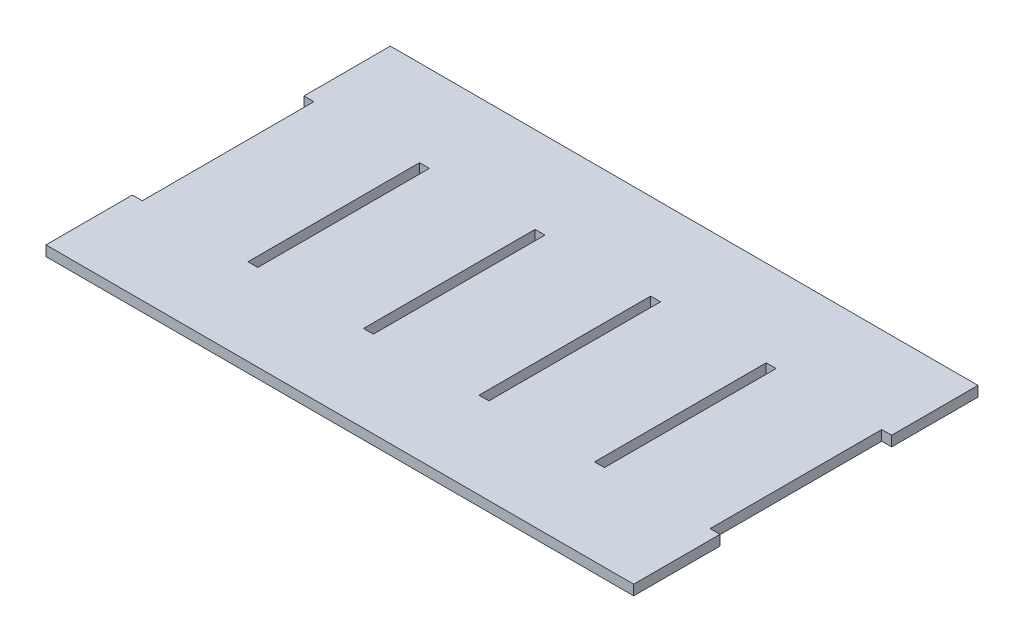
ISO-10303-21;
HEADER;
FILE_DESCRIPTION(('STEP AP214'),'2;1');
FILE_NAME('part.step','',(''),(''),'','','');
FILE_SCHEMA(('AUTOMOTIVE_DESIGN { 1 0 10303 214 1 1 1 1 }'));
ENDSEC;
DATA;
#1=APPLICATION_CONTEXT('core data for automotive mechanical design processes');
#2=APPLICATION_PROTOCOL_DEFINITION('international standard','automotive_design',2000,#1);
#3=PRODUCT_CONTEXT('',#1,'mechanical');
#4=PRODUCT('Part','Part','',(#3));
#5=PRODUCT_RELATED_PRODUCT_CATEGORY('part','',(#4));
#6=PRODUCT_DEFINITION_FORMATION('','',#4);
#7=PRODUCT_DEFINITION_CONTEXT('part definition',#1,'design');
#8=PRODUCT_DEFINITION('design','',#6,#7);
#9=PRODUCT_DEFINITION_SHAPE('','',#8);
#10=(LENGTH_UNIT() NAMED_UNIT(*) SI_UNIT(.MILLI.,.METRE.));
#11=(NAMED_UNIT(*) PLANE_ANGLE_UNIT() SI_UNIT($,.RADIAN.));
#12=(NAMED_UNIT(*) SI_UNIT($,.STERADIAN.) SOLID_ANGLE_UNIT());
#13=UNCERTAINTY_MEASURE_WITH_UNIT(LENGTH_MEASURE(1.E-05),#10,'distance_accuracy_value','');
#14=(GEOMETRIC_REPRESENTATION_CONTEXT(3) GLOBAL_UNCERTAINTY_ASSIGNED_CONTEXT((#13)) GLOBAL_UNIT_ASSIGNED_CONTEXT((#10,
#11,#12)) REPRESENTATION_CONTEXT('',''));
#15=CARTESIAN_POINT('',(0.,0.,0.));
#16=DIRECTION('',(0.,0.,1.));
#17=DIRECTION('',(1.,0.,0.));
#18=AXIS2_PLACEMENT_3D('',#15,#16,#17);
#19=CARTESIAN_POINT('',(173.4,3.,0.));
#20=DIRECTION('',(-1.,0.,0.));
#21=DIRECTION('',(0.,0.,1.));
#22=AXIS2_PLACEMENT_3D('',#19,#20,#21);
#23=PLANE('',#22);
#24=DIRECTION('',(0.,0.,-1.));
#25=VECTOR('',#24,1.);
#26=CARTESIAN_POINT('',(173.4,0.,0.));
#27=LINE('',#26,#25);
#28=CARTESIAN_POINT('',(173.4,0.,0.));
#29=VERTEX_POINT('',#28);
#30=CARTESIAN_POINT('',(173.4,0.,-25.48));
#31=VERTEX_POINT('',#30);
#32=EDGE_CURVE('E243',#29,#31,#27,.T.);
#33=ORIENTED_EDGE('',*,*,#32,.T.);
#34=DIRECTION('',(0.,1.,0.));
#35=VECTOR('',#34,1.);
#36=CARTESIAN_POINT('',(173.4,0.,-25.48));
#37=LINE('',#36,#35);
#38=CARTESIAN_POINT('',(173.4,3.,-25.48));
#39=VERTEX_POINT('',#38);
#40=EDGE_CURVE('E281',#31,#39,#37,.T.);
#41=ORIENTED_EDGE('',*,*,#40,.T.);
#42=DIRECTION('',(0.,0.,-1.));
#43=VECTOR('',#42,1.);
#44=CARTESIAN_POINT('',(173.4,3.,0.));
#45=LINE('',#44,#43);
#46=CARTESIAN_POINT('',(173.4,3.,0.));
#47=VERTEX_POINT('',#46);
#48=EDGE_CURVE('E265',#47,#39,#45,.T.);
#49=ORIENTED_EDGE('',*,*,#48,.F.);
#50=DIRECTION('',(0.,-1.,0.));
#51=VECTOR('',#50,1.);
#52=CARTESIAN_POINT('',(173.4,3.,0.));
#53=LINE('',#52,#51);
#54=EDGE_CURVE('E41',#47,#29,#53,.T.);
#55=ORIENTED_EDGE('',*,*,#54,.T.);
#56=EDGE_LOOP('',(#33,#41,#49,#55));
#57=FACE_BOUND('',#56,.T.);
#58=ADVANCED_FACE('F33',(#57),#23,.F.);
#59=CARTESIAN_POINT('',(0.,3.,0.));
#60=DIRECTION('',(1.,0.,0.));
#61=DIRECTION('',(0.,0.,-1.));
#62=AXIS2_PLACEMENT_3D('',#59,#60,#61);
#63=PLANE('',#62);
#64=DIRECTION('',(0.,0.,1.));
#65=VECTOR('',#64,1.);
#66=CARTESIAN_POINT('',(0.,3.,0.));
#67=LINE('',#66,#65);
#68=CARTESIAN_POINT('',(0.,3.,-25.48));
#69=VERTEX_POINT('',#68);
#70=CARTESIAN_POINT('',(0.,3.,0.));
#71=VERTEX_POINT('',#70);
#72=EDGE_CURVE('E252',#69,#71,#67,.T.);
#73=ORIENTED_EDGE('',*,*,#72,.F.);
#74=DIRECTION('',(0.,1.,0.));
#75=VECTOR('',#74,1.);
#76=CARTESIAN_POINT('',(0.,0.,-25.48));
#77=LINE('',#76,#75);
#78=CARTESIAN_POINT('',(0.,0.,-25.48));
#79=VERTEX_POINT('',#78);
#80=EDGE_CURVE('E433',#79,#69,#77,.T.);
#81=ORIENTED_EDGE('',*,*,#80,.F.);
#82=DIRECTION('',(0.,0.,1.));
#83=VECTOR('',#82,1.);
#84=CARTESIAN_POINT('',(0.,0.,0.));
#85=LINE('',#84,#83);
#86=CARTESIAN_POINT('',(0.,0.,0.));
#87=VERTEX_POINT('',#86);
#88=EDGE_CURVE('E432',#79,#87,#85,.T.);
#89=ORIENTED_EDGE('',*,*,#88,.T.);
#90=DIRECTION('',(0.,-1.,0.));
#91=VECTOR('',#90,1.);
#92=CARTESIAN_POINT('',(0.,3.,0.));
#93=LINE('',#92,#91);
#94=EDGE_CURVE('E11',#71,#87,#93,.T.);
#95=ORIENTED_EDGE('',*,*,#94,.F.);
#96=EDGE_LOOP('',(#73,#81,#89,#95));
#97=FACE_BOUND('',#96,.T.);
#98=ADVANCED_FACE('F451',(#97),#63,.F.);
#99=CARTESIAN_POINT('',(0.,0.,-101.6));
#100=VERTEX_POINT('',#99);
#101=CARTESIAN_POINT('',(0.,0.,-76.12));
#102=VERTEX_POINT('',#101);
#103=EDGE_CURVE('E247',#100,#102,#85,.T.);
#104=ORIENTED_EDGE('',*,*,#103,.T.);
#105=DIRECTION('',(0.,1.,0.));
#106=VECTOR('',#105,1.);
#107=CARTESIAN_POINT('',(0.,0.,-76.12));
#108=LINE('',#107,#106);
#109=CARTESIAN_POINT('',(0.,3.,-76.12));
#110=VERTEX_POINT('',#109);
#111=EDGE_CURVE('E435',#102,#110,#108,.T.);
#112=ORIENTED_EDGE('',*,*,#111,.T.);
#113=CARTESIAN_POINT('',(0.,3.,-101.6));
#114=VERTEX_POINT('',#113);
#115=EDGE_CURVE('E439',#114,#110,#67,.T.);
#116=ORIENTED_EDGE('',*,*,#115,.F.);
#117=DIRECTION('',(0.,-1.,0.));
#118=VECTOR('',#117,1.);
#119=CARTESIAN_POINT('',(0.,3.,-101.6));
#120=LINE('',#119,#118);
#121=EDGE_CURVE('E253',#114,#100,#120,.T.);
#122=ORIENTED_EDGE('',*,*,#121,.T.);
#123=EDGE_LOOP('',(#104,#112,#116,#122));
#124=FACE_BOUND('',#123,.T.);
#125=ADVANCED_FACE('F35',(#124),#63,.F.);
#126=CARTESIAN_POINT('',(0.,3.,0.));
#127=DIRECTION('',(0.,0.,-1.));
#128=DIRECTION('',(-1.,0.,0.));
#129=AXIS2_PLACEMENT_3D('',#126,#127,#128);
#130=PLANE('',#129);
#131=DIRECTION('',(1.,0.,0.));
#132=VECTOR('',#131,1.);
#133=CARTESIAN_POINT('',(0.,0.,0.));
#134=LINE('',#133,#132);
#135=EDGE_CURVE('E244',#87,#29,#134,.T.);
#136=ORIENTED_EDGE('',*,*,#135,.T.);
#137=ORIENTED_EDGE('',*,*,#54,.F.);
#138=DIRECTION('',(1.,0.,0.));
#139=VECTOR('',#138,1.);
#140=CARTESIAN_POINT('',(0.,3.,0.));
#141=LINE('',#140,#139);
#142=EDGE_CURVE('E442',#71,#47,#141,.T.);
#143=ORIENTED_EDGE('',*,*,#142,.F.);
#144=ORIENTED_EDGE('',*,*,#94,.T.);
#145=EDGE_LOOP('',(#136,#137,#143,#144));
#146=FACE_BOUND('',#145,.T.);
#147=ADVANCED_FACE('F478',(#146),#130,.F.);
#148=CARTESIAN_POINT('',(173.4,3.,-76.12));
#149=VERTEX_POINT('',#148);
#150=CARTESIAN_POINT('',(173.4,3.,-101.6));
#151=VERTEX_POINT('',#150);
#152=EDGE_CURVE('E234',#149,#151,#45,.T.);
#153=ORIENTED_EDGE('',*,*,#152,.F.);
#154=DIRECTION('',(0.,1.,0.));
#155=VECTOR('',#154,1.);
#156=CARTESIAN_POINT('',(173.4,0.,-76.12));
#157=LINE('',#156,#155);
#158=CARTESIAN_POINT('',(173.4,0.,-76.12));
#159=VERTEX_POINT('',#158);
#160=EDGE_CURVE('E221',#159,#149,#157,.T.);
#161=ORIENTED_EDGE('',*,*,#160,.F.);
#162=CARTESIAN_POINT('',(173.4,0.,-101.6));
#163=VERTEX_POINT('',#162);
#164=EDGE_CURVE('E232',#159,#163,#27,.T.);
#165=ORIENTED_EDGE('',*,*,#164,.T.);
#166=DIRECTION('',(0.,-1.,0.));
#167=VECTOR('',#166,1.);
#168=CARTESIAN_POINT('',(173.4,3.,-101.6));
#169=LINE('',#168,#167);
#170=EDGE_CURVE('E256',#151,#163,#169,.T.);
#171=ORIENTED_EDGE('',*,*,#170,.F.);
#172=EDGE_LOOP('',(#153,#161,#165,#171));
#173=FACE_BOUND('',#172,.T.);
#174=ADVANCED_FACE('F230',(#173),#23,.F.);
#175=CARTESIAN_POINT('',(0.,3.,-101.6));
#176=DIRECTION('',(0.,0.,1.));
#177=DIRECTION('',(1.,0.,0.));
#178=AXIS2_PLACEMENT_3D('',#175,#176,#177);
#179=PLANE('',#178);
#180=DIRECTION('',(-1.,0.,0.));
#181=VECTOR('',#180,1.);
#182=CARTESIAN_POINT('',(0.,0.,-101.6));
#183=LINE('',#182,#181);
#184=EDGE_CURVE('E242',#163,#100,#183,.T.);
#185=ORIENTED_EDGE('',*,*,#184,.T.);
#186=ORIENTED_EDGE('',*,*,#121,.F.);
#187=DIRECTION('',(-1.,0.,0.));
#188=VECTOR('',#187,1.);
#189=CARTESIAN_POINT('',(0.,3.,-101.6));
#190=LINE('',#189,#188);
#191=EDGE_CURVE('E257',#151,#114,#190,.T.);
#192=ORIENTED_EDGE('',*,*,#191,.F.);
#193=ORIENTED_EDGE('',*,*,#170,.T.);
#194=EDGE_LOOP('',(#185,#186,#192,#193));
#195=FACE_BOUND('',#194,.T.);
#196=ADVANCED_FACE('F469',(#195),#179,.F.);
#197=CARTESIAN_POINT('',(0.,3.,0.));
#198=DIRECTION('',(0.,-1.,0.));
#199=DIRECTION('',(0.,0.,-1.));
#200=AXIS2_PLACEMENT_3D('',#197,#198,#199);
#201=PLANE('',#200);
#202=DIRECTION('',(-1.,0.,0.));
#203=VECTOR('',#202,1.);
#204=CARTESIAN_POINT('',(37.016,3.,-76.12));
#205=LINE('',#204,#203);
#206=CARTESIAN_POINT('',(37.016,3.,-76.12));
#207=VERTEX_POINT('',#206);
#208=CARTESIAN_POINT('',(34.096,3.,-76.12));
#209=VERTEX_POINT('',#208);
#210=EDGE_CURVE('E302',#207,#209,#205,.T.);
#211=ORIENTED_EDGE('',*,*,#210,.F.);
#212=DIRECTION('',(0.,0.,-1.));
#213=VECTOR('',#212,1.);
#214=CARTESIAN_POINT('',(37.016,3.,-25.48));
#215=LINE('',#214,#213);
#216=CARTESIAN_POINT('',(37.016,3.,-25.48));
#217=VERTEX_POINT('',#216);
#218=EDGE_CURVE('E56',#217,#207,#215,.T.);
#219=ORIENTED_EDGE('',*,*,#218,.F.);
#220=DIRECTION('',(1.,0.,0.));
#221=VECTOR('',#220,1.);
#222=CARTESIAN_POINT('',(37.016,3.,-25.48));
#223=LINE('',#222,#221);
#224=CARTESIAN_POINT('',(34.096,3.,-25.48));
#225=VERTEX_POINT('',#224);
#226=EDGE_CURVE('E291',#225,#217,#223,.T.);
#227=ORIENTED_EDGE('',*,*,#226,.F.);
#228=DIRECTION('',(0.,0.,1.));
#229=VECTOR('',#228,1.);
#230=CARTESIAN_POINT('',(34.096,3.,-25.48));
#231=LINE('',#230,#229);
#232=EDGE_CURVE('E306',#209,#225,#231,.T.);
#233=ORIENTED_EDGE('',*,*,#232,.F.);
#234=EDGE_LOOP('',(#211,#219,#227,#233));
#235=FACE_BOUND('',#234,.T.);
#236=DIRECTION('',(-1.,0.,0.));
#237=VECTOR('',#236,1.);
#238=CARTESIAN_POINT('',(71.112,3.,-76.12));
#239=LINE('',#238,#237);
#240=CARTESIAN_POINT('',(71.112,3.,-76.12));
#241=VERTEX_POINT('',#240);
#242=CARTESIAN_POINT('',(68.192,3.,-76.12));
#243=VERTEX_POINT('',#242);
#244=EDGE_CURVE('E335',#241,#243,#239,.T.);
#245=ORIENTED_EDGE('',*,*,#244,.F.);
#246=DIRECTION('',(0.,0.,-1.));
#247=VECTOR('',#246,1.);
#248=CARTESIAN_POINT('',(71.112,3.,-25.48));
#249=LINE('',#248,#247);
#250=CARTESIAN_POINT('',(71.112,3.,-25.48));
#251=VERTEX_POINT('',#250);
#252=EDGE_CURVE('E333',#251,#241,#249,.T.);
#253=ORIENTED_EDGE('',*,*,#252,.F.);
#254=DIRECTION('',(1.,0.,0.));
#255=VECTOR('',#254,1.);
#256=CARTESIAN_POINT('',(71.112,3.,-25.48));
#257=LINE('',#256,#255);
#258=CARTESIAN_POINT('',(68.192,3.,-25.48));
#259=VERTEX_POINT('',#258);
#260=EDGE_CURVE('E323',#259,#251,#257,.T.);
#261=ORIENTED_EDGE('',*,*,#260,.F.);
#262=DIRECTION('',(0.,0.,1.));
#263=VECTOR('',#262,1.);
#264=CARTESIAN_POINT('',(68.192,3.,-25.48));
#265=LINE('',#264,#263);
#266=EDGE_CURVE('E339',#243,#259,#265,.T.);
#267=ORIENTED_EDGE('',*,*,#266,.F.);
#268=EDGE_LOOP('',(#245,#253,#261,#267));
#269=FACE_BOUND('',#268,.T.);
#270=DIRECTION('',(-1.,0.,0.));
#271=VECTOR('',#270,1.);
#272=CARTESIAN_POINT('',(105.208,3.,-76.12));
#273=LINE('',#272,#271);
#274=CARTESIAN_POINT('',(105.208,3.,-76.12));
#275=VERTEX_POINT('',#274);
#276=CARTESIAN_POINT('',(102.288,3.,-76.12));
#277=VERTEX_POINT('',#276);
#278=EDGE_CURVE('E367',#275,#277,#273,.T.);
#279=ORIENTED_EDGE('',*,*,#278,.F.);
#280=DIRECTION('',(0.,0.,-1.));
#281=VECTOR('',#280,1.);
#282=CARTESIAN_POINT('',(105.208,3.,-25.48));
#283=LINE('',#282,#281);
#284=CARTESIAN_POINT('',(105.208,3.,-25.48));
#285=VERTEX_POINT('',#284);
#286=EDGE_CURVE('E365',#285,#275,#283,.T.);
#287=ORIENTED_EDGE('',*,*,#286,.F.);
#288=DIRECTION('',(1.,0.,0.));
#289=VECTOR('',#288,1.);
#290=CARTESIAN_POINT('',(105.208,3.,-25.48));
#291=LINE('',#290,#289);
#292=CARTESIAN_POINT('',(102.288,3.,-25.48));
#293=VERTEX_POINT('',#292);
#294=EDGE_CURVE('E355',#293,#285,#291,.T.);
#295=ORIENTED_EDGE('',*,*,#294,.F.);
#296=DIRECTION('',(0.,0.,1.));
#297=VECTOR('',#296,1.);
#298=CARTESIAN_POINT('',(102.288,3.,-25.48));
#299=LINE('',#298,#297);
#300=EDGE_CURVE('E371',#277,#293,#299,.T.);
#301=ORIENTED_EDGE('',*,*,#300,.F.);
#302=EDGE_LOOP('',(#279,#287,#295,#301));
#303=FACE_BOUND('',#302,.T.);
#304=DIRECTION('',(-1.,0.,0.));
#305=VECTOR('',#304,1.);
#306=CARTESIAN_POINT('',(139.304,3.,-76.12));
#307=LINE('',#306,#305);
#308=CARTESIAN_POINT('',(139.304,3.,-76.12));
#309=VERTEX_POINT('',#308);
#310=CARTESIAN_POINT('',(136.384,3.,-76.12));
#311=VERTEX_POINT('',#310);
#312=EDGE_CURVE('E398',#309,#311,#307,.T.);
#313=ORIENTED_EDGE('',*,*,#312,.F.);
#314=DIRECTION('',(0.,0.,-1.));
#315=VECTOR('',#314,1.);
#316=CARTESIAN_POINT('',(139.304,3.,-25.48));
#317=LINE('',#316,#315);
#318=CARTESIAN_POINT('',(139.304,3.,-25.48));
#319=VERTEX_POINT('',#318);
#320=EDGE_CURVE('E283',#319,#309,#317,.T.);
#321=ORIENTED_EDGE('',*,*,#320,.F.);
#322=DIRECTION('',(1.,0.,0.));
#323=VECTOR('',#322,1.);
#324=CARTESIAN_POINT('',(139.304,3.,-25.48));
#325=LINE('',#324,#323);
#326=CARTESIAN_POINT('',(136.384,3.,-25.48));
#327=VERTEX_POINT('',#326);
#328=EDGE_CURVE('E387',#327,#319,#325,.T.);
#329=ORIENTED_EDGE('',*,*,#328,.F.);
#330=DIRECTION('',(0.,0.,1.));
#331=VECTOR('',#330,1.);
#332=CARTESIAN_POINT('',(136.384,3.,-25.48));
#333=LINE('',#332,#331);
#334=EDGE_CURVE('E401',#311,#327,#333,.T.);
#335=ORIENTED_EDGE('',*,*,#334,.F.);
#336=EDGE_LOOP('',(#313,#321,#329,#335));
#337=FACE_BOUND('',#336,.T.);
#338=ORIENTED_EDGE('',*,*,#48,.T.);
#339=DIRECTION('',(1.,0.,0.));
#340=VECTOR('',#339,1.);
#341=CARTESIAN_POINT('',(173.4,3.,-25.48));
#342=LINE('',#341,#340);
#343=CARTESIAN_POINT('',(170.48,3.,-25.48));
#344=VERTEX_POINT('',#343);
#345=EDGE_CURVE('E226',#344,#39,#342,.T.);
#346=ORIENTED_EDGE('',*,*,#345,.F.);
#347=DIRECTION('',(0.,0.,1.));
#348=VECTOR('',#347,1.);
#349=CARTESIAN_POINT('',(170.48,3.,-25.48));
#350=LINE('',#349,#348);
#351=CARTESIAN_POINT('',(170.48,3.,-76.12));
#352=VERTEX_POINT('',#351);
#353=EDGE_CURVE('E277',#352,#344,#350,.T.);
#354=ORIENTED_EDGE('',*,*,#353,.F.);
#355=DIRECTION('',(-1.,0.,0.));
#356=VECTOR('',#355,1.);
#357=CARTESIAN_POINT('',(173.4,3.,-76.12));
#358=LINE('',#357,#356);
#359=EDGE_CURVE('E275',#149,#352,#358,.T.);
#360=ORIENTED_EDGE('',*,*,#359,.F.);
#361=ORIENTED_EDGE('',*,*,#152,.T.);
#362=ORIENTED_EDGE('',*,*,#191,.T.);
#363=ORIENTED_EDGE('',*,*,#115,.T.);
#364=DIRECTION('',(-1.,0.,0.));
#365=VECTOR('',#364,1.);
#366=CARTESIAN_POINT('',(2.92,3.,-76.12));
#367=LINE('',#366,#365);
#368=CARTESIAN_POINT('',(2.92,3.,-76.12));
#369=VERTEX_POINT('',#368);
#370=EDGE_CURVE('E426',#369,#110,#367,.T.);
#371=ORIENTED_EDGE('',*,*,#370,.F.);
#372=DIRECTION('',(0.,0.,-1.));
#373=VECTOR('',#372,1.);
#374=CARTESIAN_POINT('',(2.92,3.,-25.48));
#375=LINE('',#374,#373);
#376=CARTESIAN_POINT('',(2.92,3.,-25.48));
#377=VERTEX_POINT('',#376);
#378=EDGE_CURVE('E313',#377,#369,#375,.T.);
#379=ORIENTED_EDGE('',*,*,#378,.F.);
#380=DIRECTION('',(1.,0.,0.));
#381=VECTOR('',#380,1.);
#382=CARTESIAN_POINT('',(2.92,3.,-25.48));
#383=LINE('',#382,#381);
#384=EDGE_CURVE('E417',#69,#377,#383,.T.);
#385=ORIENTED_EDGE('',*,*,#384,.F.);
#386=ORIENTED_EDGE('',*,*,#72,.T.);
#387=ORIENTED_EDGE('',*,*,#142,.T.);
#388=EDGE_LOOP('',(#338,#346,#354,#360,#361,#362,#363,#371,#379,#385,#386,#387));
#389=FACE_BOUND('',#388,.T.);
#390=ADVANCED_FACE('F465',(#235,#269,#303,#337,#389),#201,.F.);
#391=CARTESIAN_POINT('',(0.,0.,0.));
#392=DIRECTION('',(0.,-1.,0.));
#393=DIRECTION('',(0.,0.,-1.));
#394=AXIS2_PLACEMENT_3D('',#391,#392,#393);
#395=PLANE('',#394);
#396=DIRECTION('',(1.,0.,0.));
#397=VECTOR('',#396,1.);
#398=CARTESIAN_POINT('',(173.4,0.,-25.48));
#399=LINE('',#398,#397);
#400=CARTESIAN_POINT('',(170.48,0.,-25.48));
#401=VERTEX_POINT('',#400);
#402=EDGE_CURVE('E235',#401,#31,#399,.T.);
#403=ORIENTED_EDGE('',*,*,#402,.T.);
#404=ORIENTED_EDGE('',*,*,#32,.F.);
#405=ORIENTED_EDGE('',*,*,#135,.F.);
#406=ORIENTED_EDGE('',*,*,#88,.F.);
#407=DIRECTION('',(1.,0.,0.));
#408=VECTOR('',#407,1.);
#409=CARTESIAN_POINT('',(2.92,0.,-25.48));
#410=LINE('',#409,#408);
#411=CARTESIAN_POINT('',(2.92,0.,-25.48));
#412=VERTEX_POINT('',#411);
#413=EDGE_CURVE('E420',#79,#412,#410,.T.);
#414=ORIENTED_EDGE('',*,*,#413,.T.);
#415=DIRECTION('',(0.,0.,-1.));
#416=VECTOR('',#415,1.);
#417=CARTESIAN_POINT('',(2.92,0.,-25.48));
#418=LINE('',#417,#416);
#419=CARTESIAN_POINT('',(2.92,0.,-76.12));
#420=VERTEX_POINT('',#419);
#421=EDGE_CURVE('E413',#412,#420,#418,.T.);
#422=ORIENTED_EDGE('',*,*,#421,.T.);
#423=DIRECTION('',(-1.,0.,0.));
#424=VECTOR('',#423,1.);
#425=CARTESIAN_POINT('',(2.92,0.,-76.12));
#426=LINE('',#425,#424);
#427=EDGE_CURVE('E416',#420,#102,#426,.T.);
#428=ORIENTED_EDGE('',*,*,#427,.T.);
#429=ORIENTED_EDGE('',*,*,#103,.F.);
#430=ORIENTED_EDGE('',*,*,#184,.F.);
#431=ORIENTED_EDGE('',*,*,#164,.F.);
#432=DIRECTION('',(-1.,0.,0.));
#433=VECTOR('',#432,1.);
#434=CARTESIAN_POINT('',(173.4,0.,-76.12));
#435=LINE('',#434,#433);
#436=CARTESIAN_POINT('',(170.48,0.,-76.12));
#437=VERTEX_POINT('',#436);
#438=EDGE_CURVE('E217',#159,#437,#435,.T.);
#439=ORIENTED_EDGE('',*,*,#438,.T.);
#440=DIRECTION('',(0.,0.,1.));
#441=VECTOR('',#440,1.);
#442=CARTESIAN_POINT('',(170.48,0.,-25.48));
#443=LINE('',#442,#441);
#444=EDGE_CURVE('E48',#437,#401,#443,.T.);
#445=ORIENTED_EDGE('',*,*,#444,.T.);
#446=EDGE_LOOP('',(#403,#404,#405,#406,#414,#422,#428,#429,#430,#431,#439,#445));
#447=FACE_BOUND('',#446,.T.);
#448=DIRECTION('',(0.,0.,-1.));
#449=VECTOR('',#448,1.);
#450=CARTESIAN_POINT('',(37.016,0.,-25.48));
#451=LINE('',#450,#449);
#452=CARTESIAN_POINT('',(37.016,0.,-25.48));
#453=VERTEX_POINT('',#452);
#454=CARTESIAN_POINT('',(37.016,0.,-76.12));
#455=VERTEX_POINT('',#454);
#456=EDGE_CURVE('E287',#453,#455,#451,.T.);
#457=ORIENTED_EDGE('',*,*,#456,.T.);
#458=DIRECTION('',(-1.,0.,0.));
#459=VECTOR('',#458,1.);
#460=CARTESIAN_POINT('',(37.016,0.,-76.12));
#461=LINE('',#460,#459);
#462=CARTESIAN_POINT('',(34.096,0.,-76.12));
#463=VERTEX_POINT('',#462);
#464=EDGE_CURVE('E290',#455,#463,#461,.T.);
#465=ORIENTED_EDGE('',*,*,#464,.T.);
#466=DIRECTION('',(0.,0.,1.));
#467=VECTOR('',#466,1.);
#468=CARTESIAN_POINT('',(34.096,0.,-25.48));
#469=LINE('',#468,#467);
#470=CARTESIAN_POINT('',(34.096,0.,-25.48));
#471=VERTEX_POINT('',#470);
#472=EDGE_CURVE('E294',#463,#471,#469,.T.);
#473=ORIENTED_EDGE('',*,*,#472,.T.);
#474=DIRECTION('',(1.,0.,0.));
#475=VECTOR('',#474,1.);
#476=CARTESIAN_POINT('',(37.016,0.,-25.48));
#477=LINE('',#476,#475);
#478=EDGE_CURVE('E297',#471,#453,#477,.T.);
#479=ORIENTED_EDGE('',*,*,#478,.T.);
#480=EDGE_LOOP('',(#457,#465,#473,#479));
#481=FACE_BOUND('',#480,.T.);
#482=DIRECTION('',(0.,0.,-1.));
#483=VECTOR('',#482,1.);
#484=CARTESIAN_POINT('',(71.112,0.,-25.48));
#485=LINE('',#484,#483);
#486=CARTESIAN_POINT('',(71.112,0.,-25.48));
#487=VERTEX_POINT('',#486);
#488=CARTESIAN_POINT('',(71.112,0.,-76.12));
#489=VERTEX_POINT('',#488);
#490=EDGE_CURVE('E319',#487,#489,#485,.T.);
#491=ORIENTED_EDGE('',*,*,#490,.T.);
#492=DIRECTION('',(-1.,0.,0.));
#493=VECTOR('',#492,1.);
#494=CARTESIAN_POINT('',(71.112,0.,-76.12));
#495=LINE('',#494,#493);
#496=CARTESIAN_POINT('',(68.192,0.,-76.12));
#497=VERTEX_POINT('',#496);
#498=EDGE_CURVE('E322',#489,#497,#495,.T.);
#499=ORIENTED_EDGE('',*,*,#498,.T.);
#500=DIRECTION('',(0.,0.,1.));
#501=VECTOR('',#500,1.);
#502=CARTESIAN_POINT('',(68.192,0.,-25.48));
#503=LINE('',#502,#501);
#504=CARTESIAN_POINT('',(68.192,0.,-25.48));
#505=VERTEX_POINT('',#504);
#506=EDGE_CURVE('E326',#497,#505,#503,.T.);
#507=ORIENTED_EDGE('',*,*,#506,.T.);
#508=DIRECTION('',(1.,0.,0.));
#509=VECTOR('',#508,1.);
#510=CARTESIAN_POINT('',(71.112,0.,-25.48));
#511=LINE('',#510,#509);
#512=EDGE_CURVE('E329',#505,#487,#511,.T.);
#513=ORIENTED_EDGE('',*,*,#512,.T.);
#514=EDGE_LOOP('',(#491,#499,#507,#513));
#515=FACE_BOUND('',#514,.T.);
#516=DIRECTION('',(0.,0.,-1.));
#517=VECTOR('',#516,1.);
#518=CARTESIAN_POINT('',(105.208,0.,-25.48));
#519=LINE('',#518,#517);
#520=CARTESIAN_POINT('',(105.208,0.,-25.48));
#521=VERTEX_POINT('',#520);
#522=CARTESIAN_POINT('',(105.208,0.,-76.12));
#523=VERTEX_POINT('',#522);
#524=EDGE_CURVE('E351',#521,#523,#519,.T.);
#525=ORIENTED_EDGE('',*,*,#524,.T.);
#526=DIRECTION('',(-1.,0.,0.));
#527=VECTOR('',#526,1.);
#528=CARTESIAN_POINT('',(105.208,0.,-76.12));
#529=LINE('',#528,#527);
#530=CARTESIAN_POINT('',(102.288,0.,-76.12));
#531=VERTEX_POINT('',#530);
#532=EDGE_CURVE('E354',#523,#531,#529,.T.);
#533=ORIENTED_EDGE('',*,*,#532,.T.);
#534=DIRECTION('',(0.,0.,1.));
#535=VECTOR('',#534,1.);
#536=CARTESIAN_POINT('',(102.288,0.,-25.48));
#537=LINE('',#536,#535);
#538=CARTESIAN_POINT('',(102.288,0.,-25.48));
#539=VERTEX_POINT('',#538);
#540=EDGE_CURVE('E358',#531,#539,#537,.T.);
#541=ORIENTED_EDGE('',*,*,#540,.T.);
#542=DIRECTION('',(1.,0.,0.));
#543=VECTOR('',#542,1.);
#544=CARTESIAN_POINT('',(105.208,0.,-25.48));
#545=LINE('',#544,#543);
#546=EDGE_CURVE('E361',#539,#521,#545,.T.);
#547=ORIENTED_EDGE('',*,*,#546,.T.);
#548=EDGE_LOOP('',(#525,#533,#541,#547));
#549=FACE_BOUND('',#548,.T.);
#550=DIRECTION('',(0.,0.,-1.));
#551=VECTOR('',#550,1.);
#552=CARTESIAN_POINT('',(139.304,0.,-25.48));
#553=LINE('',#552,#551);
#554=CARTESIAN_POINT('',(139.304,0.,-25.48));
#555=VERTEX_POINT('',#554);
#556=CARTESIAN_POINT('',(139.304,0.,-76.12));
#557=VERTEX_POINT('',#556);
#558=EDGE_CURVE('E383',#555,#557,#553,.T.);
#559=ORIENTED_EDGE('',*,*,#558,.T.);
#560=DIRECTION('',(-1.,0.,0.));
#561=VECTOR('',#560,1.);
#562=CARTESIAN_POINT('',(139.304,0.,-76.12));
#563=LINE('',#562,#561);
#564=CARTESIAN_POINT('',(136.384,0.,-76.12));
#565=VERTEX_POINT('',#564);
#566=EDGE_CURVE('E386',#557,#565,#563,.T.);
#567=ORIENTED_EDGE('',*,*,#566,.T.);
#568=DIRECTION('',(0.,0.,1.));
#569=VECTOR('',#568,1.);
#570=CARTESIAN_POINT('',(136.384,0.,-25.48));
#571=LINE('',#570,#569);
#572=CARTESIAN_POINT('',(136.384,0.,-25.48));
#573=VERTEX_POINT('',#572);
#574=EDGE_CURVE('E390',#565,#573,#571,.T.);
#575=ORIENTED_EDGE('',*,*,#574,.T.);
#576=DIRECTION('',(1.,0.,0.));
#577=VECTOR('',#576,1.);
#578=CARTESIAN_POINT('',(139.304,0.,-25.48));
#579=LINE('',#578,#577);
#580=EDGE_CURVE('E393',#573,#555,#579,.T.);
#581=ORIENTED_EDGE('',*,*,#580,.T.);
#582=EDGE_LOOP('',(#559,#567,#575,#581));
#583=FACE_BOUND('',#582,.T.);
#584=ADVANCED_FACE('F239',(#447,#481,#515,#549,#583),#395,.T.);
#585=CARTESIAN_POINT('',(2.92,0.,-25.48));
#586=DIRECTION('',(1.,0.,0.));
#587=DIRECTION('',(0.,0.,-1.));
#588=AXIS2_PLACEMENT_3D('',#585,#586,#587);
#589=PLANE('',#588);
#590=ORIENTED_EDGE('',*,*,#378,.T.);
#591=DIRECTION('',(0.,1.,0.));
#592=VECTOR('',#591,1.);
#593=CARTESIAN_POINT('',(2.92,0.,-76.12));
#594=LINE('',#593,#592);
#595=EDGE_CURVE('E423',#420,#369,#594,.T.);
#596=ORIENTED_EDGE('',*,*,#595,.F.);
#597=ORIENTED_EDGE('',*,*,#421,.F.);
#598=DIRECTION('',(0.,1.,0.));
#599=VECTOR('',#598,1.);
#600=CARTESIAN_POINT('',(2.92,0.,-25.48));
#601=LINE('',#600,#599);
#602=EDGE_CURVE('E430',#412,#377,#601,.T.);
#603=ORIENTED_EDGE('',*,*,#602,.T.);
#604=EDGE_LOOP('',(#590,#596,#597,#603));
#605=FACE_BOUND('',#604,.T.);
#606=ADVANCED_FACE('F458',(#605),#589,.F.);
#607=CARTESIAN_POINT('',(2.92,0.,-25.48));
#608=DIRECTION('',(0.,0.,1.));
#609=DIRECTION('',(1.,0.,0.));
#610=AXIS2_PLACEMENT_3D('',#607,#608,#609);
#611=PLANE('',#610);
#612=ORIENTED_EDGE('',*,*,#384,.T.);
#613=ORIENTED_EDGE('',*,*,#602,.F.);
#614=ORIENTED_EDGE('',*,*,#413,.F.);
#615=ORIENTED_EDGE('',*,*,#80,.T.);
#616=EDGE_LOOP('',(#612,#613,#614,#615));
#617=FACE_BOUND('',#616,.T.);
#618=ADVANCED_FACE('F454',(#617),#611,.F.);
#619=CARTESIAN_POINT('',(2.92,0.,-76.12));
#620=DIRECTION('',(0.,0.,-1.));
#621=DIRECTION('',(-1.,0.,0.));
#622=AXIS2_PLACEMENT_3D('',#619,#620,#621);
#623=PLANE('',#622);
#624=ORIENTED_EDGE('',*,*,#370,.T.);
#625=ORIENTED_EDGE('',*,*,#111,.F.);
#626=ORIENTED_EDGE('',*,*,#427,.F.);
#627=ORIENTED_EDGE('',*,*,#595,.T.);
#628=EDGE_LOOP('',(#624,#625,#626,#627));
#629=FACE_BOUND('',#628,.T.);
#630=ADVANCED_FACE('F462',(#629),#623,.F.);
#631=CARTESIAN_POINT('',(139.304,0.,-25.48));
#632=DIRECTION('',(1.,0.,0.));
#633=DIRECTION('',(0.,0.,-1.));
#634=AXIS2_PLACEMENT_3D('',#631,#632,#633);
#635=PLANE('',#634);
#636=ORIENTED_EDGE('',*,*,#320,.T.);
#637=DIRECTION('',(0.,1.,0.));
#638=VECTOR('',#637,1.);
#639=CARTESIAN_POINT('',(139.304,0.,-76.12));
#640=LINE('',#639,#638);
#641=EDGE_CURVE('E396',#557,#309,#640,.T.);
#642=ORIENTED_EDGE('',*,*,#641,.F.);
#643=ORIENTED_EDGE('',*,*,#558,.F.);
#644=DIRECTION('',(0.,1.,0.));
#645=VECTOR('',#644,1.);
#646=CARTESIAN_POINT('',(139.304,0.,-25.48));
#647=LINE('',#646,#645);
#648=EDGE_CURVE('E368',#555,#319,#647,.T.);
#649=ORIENTED_EDGE('',*,*,#648,.T.);
#650=EDGE_LOOP('',(#636,#642,#643,#649));
#651=FACE_BOUND('',#650,.T.);
#652=ADVANCED_FACE('F554',(#651),#635,.F.);
#653=CARTESIAN_POINT('',(139.304,0.,-25.48));
#654=DIRECTION('',(0.,0.,1.));
#655=DIRECTION('',(1.,0.,0.));
#656=AXIS2_PLACEMENT_3D('',#653,#654,#655);
#657=PLANE('',#656);
#658=ORIENTED_EDGE('',*,*,#328,.T.);
#659=ORIENTED_EDGE('',*,*,#648,.F.);
#660=ORIENTED_EDGE('',*,*,#580,.F.);
#661=DIRECTION('',(0.,1.,0.));
#662=VECTOR('',#661,1.);
#663=CARTESIAN_POINT('',(136.384,0.,-25.48));
#664=LINE('',#663,#662);
#665=EDGE_CURVE('E407',#573,#327,#664,.T.);
#666=ORIENTED_EDGE('',*,*,#665,.T.);
#667=EDGE_LOOP('',(#658,#659,#660,#666));
#668=FACE_BOUND('',#667,.T.);
#669=ADVANCED_FACE('F550',(#668),#657,.F.);
#670=CARTESIAN_POINT('',(136.384,0.,-25.48));
#671=DIRECTION('',(-1.,0.,0.));
#672=DIRECTION('',(0.,0.,1.));
#673=AXIS2_PLACEMENT_3D('',#670,#671,#672);
#674=PLANE('',#673);
#675=ORIENTED_EDGE('',*,*,#334,.T.);
#676=ORIENTED_EDGE('',*,*,#665,.F.);
#677=ORIENTED_EDGE('',*,*,#574,.F.);
#678=DIRECTION('',(0.,1.,0.));
#679=VECTOR('',#678,1.);
#680=CARTESIAN_POINT('',(136.384,0.,-76.12));
#681=LINE('',#680,#679);
#682=EDGE_CURVE('E409',#565,#311,#681,.T.);
#683=ORIENTED_EDGE('',*,*,#682,.T.);
#684=EDGE_LOOP('',(#675,#676,#677,#683));
#685=FACE_BOUND('',#684,.T.);
#686=ADVANCED_FACE('F553',(#685),#674,.F.);
#687=CARTESIAN_POINT('',(139.304,0.,-76.12));
#688=DIRECTION('',(0.,0.,-1.));
#689=DIRECTION('',(-1.,0.,0.));
#690=AXIS2_PLACEMENT_3D('',#687,#688,#689);
#691=PLANE('',#690);
#692=ORIENTED_EDGE('',*,*,#312,.T.);
#693=ORIENTED_EDGE('',*,*,#682,.F.);
#694=ORIENTED_EDGE('',*,*,#566,.F.);
#695=ORIENTED_EDGE('',*,*,#641,.T.);
#696=EDGE_LOOP('',(#692,#693,#694,#695));
#697=FACE_BOUND('',#696,.T.);
#698=ADVANCED_FACE('F548',(#697),#691,.F.);
#699=CARTESIAN_POINT('',(105.208,0.,-25.48));
#700=DIRECTION('',(1.,0.,0.));
#701=DIRECTION('',(0.,0.,-1.));
#702=AXIS2_PLACEMENT_3D('',#699,#700,#701);
#703=PLANE('',#702);
#704=ORIENTED_EDGE('',*,*,#286,.T.);
#705=DIRECTION('',(0.,1.,0.));
#706=VECTOR('',#705,1.);
#707=CARTESIAN_POINT('',(105.208,0.,-76.12));
#708=LINE('',#707,#706);
#709=EDGE_CURVE('E364',#523,#275,#708,.T.);
#710=ORIENTED_EDGE('',*,*,#709,.F.);
#711=ORIENTED_EDGE('',*,*,#524,.F.);
#712=DIRECTION('',(0.,1.,0.));
#713=VECTOR('',#712,1.);
#714=CARTESIAN_POINT('',(105.208,0.,-25.48));
#715=LINE('',#714,#713);
#716=EDGE_CURVE('E336',#521,#285,#715,.T.);
#717=ORIENTED_EDGE('',*,*,#716,.T.);
#718=EDGE_LOOP('',(#704,#710,#711,#717));
#719=FACE_BOUND('',#718,.T.);
#720=ADVANCED_FACE('F538',(#719),#703,.F.);
#721=CARTESIAN_POINT('',(105.208,0.,-25.48));
#722=DIRECTION('',(0.,0.,1.));
#723=DIRECTION('',(1.,0.,0.));
#724=AXIS2_PLACEMENT_3D('',#721,#722,#723);
#725=PLANE('',#724);
#726=ORIENTED_EDGE('',*,*,#294,.T.);
#727=ORIENTED_EDGE('',*,*,#716,.F.);
#728=ORIENTED_EDGE('',*,*,#546,.F.);
#729=DIRECTION('',(0.,1.,0.));
#730=VECTOR('',#729,1.);
#731=CARTESIAN_POINT('',(102.288,0.,-25.48));
#732=LINE('',#731,#730);
#733=EDGE_CURVE('E377',#539,#293,#732,.T.);
#734=ORIENTED_EDGE('',*,*,#733,.T.);
#735=EDGE_LOOP('',(#726,#727,#728,#734));
#736=FACE_BOUND('',#735,.T.);
#737=ADVANCED_FACE('F534',(#736),#725,.F.);
#738=CARTESIAN_POINT('',(102.288,0.,-25.48));
#739=DIRECTION('',(-1.,0.,0.));
#740=DIRECTION('',(0.,0.,1.));
#741=AXIS2_PLACEMENT_3D('',#738,#739,#740);
#742=PLANE('',#741);
#743=ORIENTED_EDGE('',*,*,#300,.T.);
#744=ORIENTED_EDGE('',*,*,#733,.F.);
#745=ORIENTED_EDGE('',*,*,#540,.F.);
#746=DIRECTION('',(0.,1.,0.));
#747=VECTOR('',#746,1.);
#748=CARTESIAN_POINT('',(102.288,0.,-76.12));
#749=LINE('',#748,#747);
#750=EDGE_CURVE('E379',#531,#277,#749,.T.);
#751=ORIENTED_EDGE('',*,*,#750,.T.);
#752=EDGE_LOOP('',(#743,#744,#745,#751));
#753=FACE_BOUND('',#752,.T.);
#754=ADVANCED_FACE('F537',(#753),#742,.F.);
#755=CARTESIAN_POINT('',(105.208,0.,-76.12));
#756=DIRECTION('',(0.,0.,-1.));
#757=DIRECTION('',(-1.,0.,0.));
#758=AXIS2_PLACEMENT_3D('',#755,#756,#757);
#759=PLANE('',#758);
#760=ORIENTED_EDGE('',*,*,#278,.T.);
#761=ORIENTED_EDGE('',*,*,#750,.F.);
#762=ORIENTED_EDGE('',*,*,#532,.F.);
#763=ORIENTED_EDGE('',*,*,#709,.T.);
#764=EDGE_LOOP('',(#760,#761,#762,#763));
#765=FACE_BOUND('',#764,.T.);
#766=ADVANCED_FACE('F532',(#765),#759,.F.);
#767=CARTESIAN_POINT('',(71.112,0.,-25.48));
#768=DIRECTION('',(1.,0.,0.));
#769=DIRECTION('',(0.,0.,-1.));
#770=AXIS2_PLACEMENT_3D('',#767,#768,#769);
#771=PLANE('',#770);
#772=ORIENTED_EDGE('',*,*,#252,.T.);
#773=DIRECTION('',(0.,1.,0.));
#774=VECTOR('',#773,1.);
#775=CARTESIAN_POINT('',(71.112,0.,-76.12));
#776=LINE('',#775,#774);
#777=EDGE_CURVE('E332',#489,#241,#776,.T.);
#778=ORIENTED_EDGE('',*,*,#777,.F.);
#779=ORIENTED_EDGE('',*,*,#490,.F.);
#780=DIRECTION('',(0.,1.,0.));
#781=VECTOR('',#780,1.);
#782=CARTESIAN_POINT('',(71.112,0.,-25.48));
#783=LINE('',#782,#781);
#784=EDGE_CURVE('E303',#487,#251,#783,.T.);
#785=ORIENTED_EDGE('',*,*,#784,.T.);
#786=EDGE_LOOP('',(#772,#778,#779,#785));
#787=FACE_BOUND('',#786,.T.);
#788=ADVANCED_FACE('F522',(#787),#771,.F.);
#789=CARTESIAN_POINT('',(71.112,0.,-25.48));
#790=DIRECTION('',(0.,0.,1.));
#791=DIRECTION('',(1.,0.,0.));
#792=AXIS2_PLACEMENT_3D('',#789,#790,#791);
#793=PLANE('',#792);
#794=ORIENTED_EDGE('',*,*,#260,.T.);
#795=ORIENTED_EDGE('',*,*,#784,.F.);
#796=ORIENTED_EDGE('',*,*,#512,.F.);
#797=DIRECTION('',(0.,1.,0.));
#798=VECTOR('',#797,1.);
#799=CARTESIAN_POINT('',(68.192,0.,-25.48));
#800=LINE('',#799,#798);
#801=EDGE_CURVE('E345',#505,#259,#800,.T.);
#802=ORIENTED_EDGE('',*,*,#801,.T.);
#803=EDGE_LOOP('',(#794,#795,#796,#802));
#804=FACE_BOUND('',#803,.T.);
#805=ADVANCED_FACE('F518',(#804),#793,.F.);
#806=CARTESIAN_POINT('',(68.192,0.,-25.48));
#807=DIRECTION('',(-1.,0.,0.));
#808=DIRECTION('',(0.,0.,1.));
#809=AXIS2_PLACEMENT_3D('',#806,#807,#808);
#810=PLANE('',#809);
#811=ORIENTED_EDGE('',*,*,#266,.T.);
#812=ORIENTED_EDGE('',*,*,#801,.F.);
#813=ORIENTED_EDGE('',*,*,#506,.F.);
#814=DIRECTION('',(0.,1.,0.));
#815=VECTOR('',#814,1.);
#816=CARTESIAN_POINT('',(68.192,0.,-76.12));
#817=LINE('',#816,#815);
#818=EDGE_CURVE('E347',#497,#243,#817,.T.);
#819=ORIENTED_EDGE('',*,*,#818,.T.);
#820=EDGE_LOOP('',(#811,#812,#813,#819));
#821=FACE_BOUND('',#820,.T.);
#822=ADVANCED_FACE('F521',(#821),#810,.F.);
#823=CARTESIAN_POINT('',(71.112,0.,-76.12));
#824=DIRECTION('',(0.,0.,-1.));
#825=DIRECTION('',(-1.,0.,0.));
#826=AXIS2_PLACEMENT_3D('',#823,#824,#825);
#827=PLANE('',#826);
#828=ORIENTED_EDGE('',*,*,#244,.T.);
#829=ORIENTED_EDGE('',*,*,#818,.F.);
#830=ORIENTED_EDGE('',*,*,#498,.F.);
#831=ORIENTED_EDGE('',*,*,#777,.T.);
#832=EDGE_LOOP('',(#828,#829,#830,#831));
#833=FACE_BOUND('',#832,.T.);
#834=ADVANCED_FACE('F517',(#833),#827,.F.);
#835=CARTESIAN_POINT('',(37.016,0.,-25.48));
#836=DIRECTION('',(1.,0.,0.));
#837=DIRECTION('',(0.,0.,-1.));
#838=AXIS2_PLACEMENT_3D('',#835,#836,#837);
#839=PLANE('',#838);
#840=ORIENTED_EDGE('',*,*,#218,.T.);
#841=DIRECTION('',(0.,1.,0.));
#842=VECTOR('',#841,1.);
#843=CARTESIAN_POINT('',(37.016,0.,-76.12));
#844=LINE('',#843,#842);
#845=EDGE_CURVE('E300',#455,#207,#844,.T.);
#846=ORIENTED_EDGE('',*,*,#845,.F.);
#847=ORIENTED_EDGE('',*,*,#456,.F.);
#848=DIRECTION('',(0.,1.,0.));
#849=VECTOR('',#848,1.);
#850=CARTESIAN_POINT('',(37.016,0.,-25.48));
#851=LINE('',#850,#849);
#852=EDGE_CURVE('E311',#453,#217,#851,.T.);
#853=ORIENTED_EDGE('',*,*,#852,.T.);
#854=EDGE_LOOP('',(#840,#846,#847,#853));
#855=FACE_BOUND('',#854,.T.);
#856=ADVANCED_FACE('F507',(#855),#839,.F.);
#857=CARTESIAN_POINT('',(37.016,0.,-25.48));
#858=DIRECTION('',(0.,0.,1.));
#859=DIRECTION('',(1.,0.,0.));
#860=AXIS2_PLACEMENT_3D('',#857,#858,#859);
#861=PLANE('',#860);
#862=ORIENTED_EDGE('',*,*,#226,.T.);
#863=ORIENTED_EDGE('',*,*,#852,.F.);
#864=ORIENTED_EDGE('',*,*,#478,.F.);
#865=DIRECTION('',(0.,1.,0.));
#866=VECTOR('',#865,1.);
#867=CARTESIAN_POINT('',(34.096,0.,-25.48));
#868=LINE('',#867,#866);
#869=EDGE_CURVE('E314',#471,#225,#868,.T.);
#870=ORIENTED_EDGE('',*,*,#869,.T.);
#871=EDGE_LOOP('',(#862,#863,#864,#870));
#872=FACE_BOUND('',#871,.T.);
#873=ADVANCED_FACE('F503',(#872),#861,.F.);
#874=CARTESIAN_POINT('',(34.096,0.,-25.48));
#875=DIRECTION('',(-1.,0.,0.));
#876=DIRECTION('',(0.,0.,1.));
#877=AXIS2_PLACEMENT_3D('',#874,#875,#876);
#878=PLANE('',#877);
#879=ORIENTED_EDGE('',*,*,#232,.T.);
#880=ORIENTED_EDGE('',*,*,#869,.F.);
#881=ORIENTED_EDGE('',*,*,#472,.F.);
#882=DIRECTION('',(0.,1.,0.));
#883=VECTOR('',#882,1.);
#884=CARTESIAN_POINT('',(34.096,0.,-76.12));
#885=LINE('',#884,#883);
#886=EDGE_CURVE('E316',#463,#209,#885,.T.);
#887=ORIENTED_EDGE('',*,*,#886,.T.);
#888=EDGE_LOOP('',(#879,#880,#881,#887));
#889=FACE_BOUND('',#888,.T.);
#890=ADVANCED_FACE('F506',(#889),#878,.F.);
#891=CARTESIAN_POINT('',(37.016,0.,-76.12));
#892=DIRECTION('',(0.,0.,-1.));
#893=DIRECTION('',(-1.,0.,0.));
#894=AXIS2_PLACEMENT_3D('',#891,#892,#893);
#895=PLANE('',#894);
#896=ORIENTED_EDGE('',*,*,#210,.T.);
#897=ORIENTED_EDGE('',*,*,#886,.F.);
#898=ORIENTED_EDGE('',*,*,#464,.F.);
#899=ORIENTED_EDGE('',*,*,#845,.T.);
#900=EDGE_LOOP('',(#896,#897,#898,#899));
#901=FACE_BOUND('',#900,.T.);
#902=ADVANCED_FACE('F500',(#901),#895,.F.);
#903=CARTESIAN_POINT('',(173.4,0.,-25.48));
#904=DIRECTION('',(0.,0.,1.));
#905=DIRECTION('',(1.,0.,0.));
#906=AXIS2_PLACEMENT_3D('',#903,#904,#905);
#907=PLANE('',#906);
#908=ORIENTED_EDGE('',*,*,#345,.T.);
#909=ORIENTED_EDGE('',*,*,#40,.F.);
#910=ORIENTED_EDGE('',*,*,#402,.F.);
#911=DIRECTION('',(0.,1.,0.));
#912=VECTOR('',#911,1.);
#913=CARTESIAN_POINT('',(170.48,0.,-25.48));
#914=LINE('',#913,#912);
#915=EDGE_CURVE('E284',#401,#344,#914,.T.);
#916=ORIENTED_EDGE('',*,*,#915,.T.);
#917=EDGE_LOOP('',(#908,#909,#910,#916));
#918=FACE_BOUND('',#917,.T.);
#919=ADVANCED_FACE('F491',(#918),#907,.F.);
#920=CARTESIAN_POINT('',(170.48,0.,-25.48));
#921=DIRECTION('',(-1.,0.,0.));
#922=DIRECTION('',(0.,0.,1.));
#923=AXIS2_PLACEMENT_3D('',#920,#921,#922);
#924=PLANE('',#923);
#925=ORIENTED_EDGE('',*,*,#353,.T.);
#926=ORIENTED_EDGE('',*,*,#915,.F.);
#927=ORIENTED_EDGE('',*,*,#444,.F.);
#928=DIRECTION('',(0.,1.,0.));
#929=VECTOR('',#928,1.);
#930=CARTESIAN_POINT('',(170.48,0.,-76.12));
#931=LINE('',#930,#929);
#932=EDGE_CURVE('E223',#437,#352,#931,.T.);
#933=ORIENTED_EDGE('',*,*,#932,.T.);
#934=EDGE_LOOP('',(#925,#926,#927,#933));
#935=FACE_BOUND('',#934,.T.);
#936=ADVANCED_FACE('F492',(#935),#924,.F.);
#937=CARTESIAN_POINT('',(173.4,0.,-76.12));
#938=DIRECTION('',(0.,0.,-1.));
#939=DIRECTION('',(-1.,0.,0.));
#940=AXIS2_PLACEMENT_3D('',#937,#938,#939);
#941=PLANE('',#940);
#942=ORIENTED_EDGE('',*,*,#359,.T.);
#943=ORIENTED_EDGE('',*,*,#932,.F.);
#944=ORIENTED_EDGE('',*,*,#438,.F.);
#945=ORIENTED_EDGE('',*,*,#160,.T.);
#946=EDGE_LOOP('',(#942,#943,#944,#945));
#947=FACE_BOUND('',#946,.T.);
#948=ADVANCED_FACE('F220',(#947),#941,.F.);
#949=CLOSED_SHELL('',(#58,#98,#125,#147,#174,#196,#390,#584,#606,#618,#630,#652,#669,#686,#698,
#720,#737,#754,#766,#788,#805,#822,#834,#856,#873,#890,#902,#919,#936,#948));
#950=MANIFOLD_SOLID_BREP('B2',#949);
#951=ADVANCED_BREP_SHAPE_REPRESENTATION('',(#18,#950),#14);
#952=SHAPE_DEFINITION_REPRESENTATION(#9,#951);
ENDSEC;
END-ISO-10303-21;
